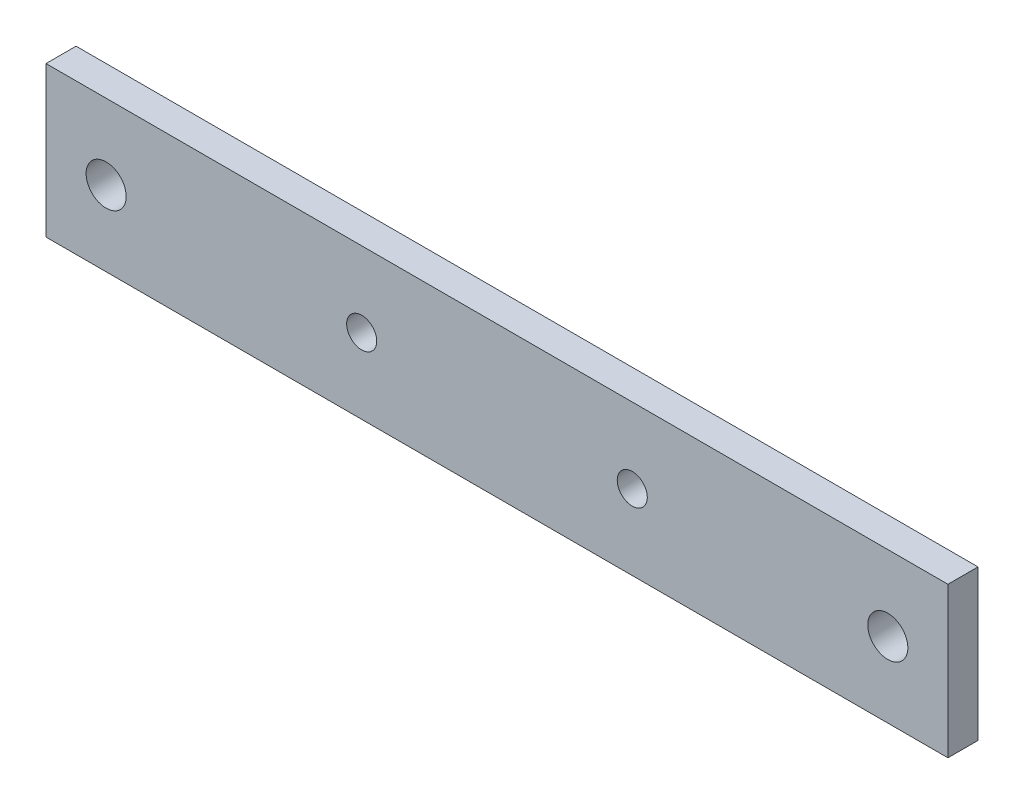
ISO-10303-21;
HEADER;
FILE_DESCRIPTION(('STEP AP214'),'2;1');
FILE_NAME('part.step','',(''),(''),'','','');
FILE_SCHEMA(('AUTOMOTIVE_DESIGN { 1 0 10303 214 1 1 1 1 }'));
ENDSEC;
DATA;
#1=APPLICATION_CONTEXT('core data for automotive mechanical design processes');
#2=APPLICATION_PROTOCOL_DEFINITION('international standard','automotive_design',2000,#1);
#3=PRODUCT_CONTEXT('',#1,'mechanical');
#4=PRODUCT('Part','Part','',(#3));
#5=PRODUCT_RELATED_PRODUCT_CATEGORY('part','',(#4));
#6=PRODUCT_DEFINITION_FORMATION('','',#4);
#7=PRODUCT_DEFINITION_CONTEXT('part definition',#1,'design');
#8=PRODUCT_DEFINITION('design','',#6,#7);
#9=PRODUCT_DEFINITION_SHAPE('','',#8);
#10=(LENGTH_UNIT() NAMED_UNIT(*) SI_UNIT(.MILLI.,.METRE.));
#11=(NAMED_UNIT(*) PLANE_ANGLE_UNIT() SI_UNIT($,.RADIAN.));
#12=(NAMED_UNIT(*) SI_UNIT($,.STERADIAN.) SOLID_ANGLE_UNIT());
#13=UNCERTAINTY_MEASURE_WITH_UNIT(LENGTH_MEASURE(1.E-05),#10,'distance_accuracy_value','');
#14=(GEOMETRIC_REPRESENTATION_CONTEXT(3) GLOBAL_UNCERTAINTY_ASSIGNED_CONTEXT((#13)) GLOBAL_UNIT_ASSIGNED_CONTEXT((#10,
#11,#12)) REPRESENTATION_CONTEXT('',''));
#15=CARTESIAN_POINT('',(0.,0.,0.));
#16=DIRECTION('',(0.,0.,1.));
#17=DIRECTION('',(1.,0.,0.));
#18=AXIS2_PLACEMENT_3D('',#15,#16,#17);
#19=CARTESIAN_POINT('',(0.,0.,3.));
#20=DIRECTION('',(0.,0.,1.));
#21=DIRECTION('',(1.,0.,0.));
#22=AXIS2_PLACEMENT_3D('',#19,#20,#21);
#23=PLANE('',#22);
#24=CARTESIAN_POINT('',(-39.,0.,3.));
#25=DIRECTION('',(0.,0.,1.));
#26=DIRECTION('',(1.,0.,0.));
#27=AXIS2_PLACEMENT_3D('',#24,#25,#26);
#28=CIRCLE('',#27,2.);
#29=CARTESIAN_POINT('',(-37.,0.,3.));
#30=VERTEX_POINT('',#29);
#31=EDGE_CURVE('E127',#30,#30,#28,.T.);
#32=ORIENTED_EDGE('',*,*,#31,.F.);
#33=EDGE_LOOP('',(#32));
#34=FACE_BOUND('',#33,.T.);
#35=CARTESIAN_POINT('',(-13.5,0.,3.));
#36=DIRECTION('',(0.,0.,1.));
#37=DIRECTION('',(1.,0.,0.));
#38=AXIS2_PLACEMENT_3D('',#35,#36,#37);
#39=CIRCLE('',#38,1.5);
#40=CARTESIAN_POINT('',(-12.,0.,3.));
#41=VERTEX_POINT('',#40);
#42=EDGE_CURVE('E106',#41,#41,#39,.T.);
#43=ORIENTED_EDGE('',*,*,#42,.F.);
#44=EDGE_LOOP('',(#43));
#45=FACE_BOUND('',#44,.T.);
#46=DIRECTION('',(0.,-1.,0.));
#47=VECTOR('',#46,1.);
#48=CARTESIAN_POINT('',(-45.,-7.50000000000001,3.));
#49=LINE('',#48,#47);
#50=CARTESIAN_POINT('',(-45.,7.49999999999999,3.));
#51=VERTEX_POINT('',#50);
#52=CARTESIAN_POINT('',(-45.,-7.50000000000001,3.));
#53=VERTEX_POINT('',#52);
#54=EDGE_CURVE('E91',#51,#53,#49,.T.);
#55=ORIENTED_EDGE('',*,*,#54,.T.);
#56=DIRECTION('',(1.,0.,0.));
#57=VECTOR('',#56,1.);
#58=CARTESIAN_POINT('',(45.,-7.49999999999999,3.));
#59=LINE('',#58,#57);
#60=CARTESIAN_POINT('',(45.,-7.49999999999999,3.));
#61=VERTEX_POINT('',#60);
#62=EDGE_CURVE('E86',#53,#61,#59,.T.);
#63=ORIENTED_EDGE('',*,*,#62,.T.);
#64=DIRECTION('',(0.,1.,0.));
#65=VECTOR('',#64,1.);
#66=CARTESIAN_POINT('',(45.,-7.49999999999999,3.));
#67=LINE('',#66,#65);
#68=CARTESIAN_POINT('',(45.,7.50000000000001,3.));
#69=VERTEX_POINT('',#68);
#70=EDGE_CURVE('E89',#61,#69,#67,.T.);
#71=ORIENTED_EDGE('',*,*,#70,.T.);
#72=DIRECTION('',(-1.,0.,0.));
#73=VECTOR('',#72,1.);
#74=CARTESIAN_POINT('',(45.,7.50000000000001,3.));
#75=LINE('',#74,#73);
#76=EDGE_CURVE('E56',#69,#51,#75,.T.);
#77=ORIENTED_EDGE('',*,*,#76,.T.);
#78=EDGE_LOOP('',(#55,#63,#71,#77));
#79=FACE_BOUND('',#78,.T.);
#80=CARTESIAN_POINT('',(13.5,0.,3.));
#81=DIRECTION('',(0.,0.,1.));
#82=DIRECTION('',(-1.,0.,0.));
#83=AXIS2_PLACEMENT_3D('',#80,#81,#82);
#84=CIRCLE('',#83,1.5);
#85=CARTESIAN_POINT('',(12.,0.,3.));
#86=VERTEX_POINT('',#85);
#87=EDGE_CURVE('E121',#86,#86,#84,.T.);
#88=ORIENTED_EDGE('',*,*,#87,.F.);
#89=EDGE_LOOP('',(#88));
#90=FACE_BOUND('',#89,.T.);
#91=CARTESIAN_POINT('',(39.,0.,3.));
#92=DIRECTION('',(0.,0.,1.));
#93=DIRECTION('',(-1.,0.,0.));
#94=AXIS2_PLACEMENT_3D('',#91,#92,#93);
#95=CIRCLE('',#94,2.);
#96=CARTESIAN_POINT('',(37.,0.,3.));
#97=VERTEX_POINT('',#96);
#98=EDGE_CURVE('E133',#97,#97,#95,.T.);
#99=ORIENTED_EDGE('',*,*,#98,.F.);
#100=EDGE_LOOP('',(#99));
#101=FACE_BOUND('',#100,.T.);
#102=ADVANCED_FACE('F39',(#34,#45,#79,#90,#101),#23,.T.);
#103=CARTESIAN_POINT('',(0.,0.,0.));
#104=DIRECTION('',(0.,0.,1.));
#105=DIRECTION('',(1.,0.,0.));
#106=AXIS2_PLACEMENT_3D('',#103,#104,#105);
#107=PLANE('',#106);
#108=DIRECTION('',(0.,-1.,0.));
#109=VECTOR('',#108,1.);
#110=CARTESIAN_POINT('',(-45.,-7.50000000000001,0.));
#111=LINE('',#110,#109);
#112=CARTESIAN_POINT('',(-45.,7.49999999999999,0.));
#113=VERTEX_POINT('',#112);
#114=CARTESIAN_POINT('',(-45.,-7.50000000000001,0.));
#115=VERTEX_POINT('',#114);
#116=EDGE_CURVE('E103',#113,#115,#111,.T.);
#117=ORIENTED_EDGE('',*,*,#116,.F.);
#118=DIRECTION('',(-1.,0.,0.));
#119=VECTOR('',#118,1.);
#120=CARTESIAN_POINT('',(45.,7.50000000000001,0.));
#121=LINE('',#120,#119);
#122=CARTESIAN_POINT('',(45.,7.50000000000001,0.));
#123=VERTEX_POINT('',#122);
#124=EDGE_CURVE('E79',#123,#113,#121,.T.);
#125=ORIENTED_EDGE('',*,*,#124,.F.);
#126=DIRECTION('',(0.,1.,0.));
#127=VECTOR('',#126,1.);
#128=CARTESIAN_POINT('',(45.,-7.49999999999999,0.));
#129=LINE('',#128,#127);
#130=CARTESIAN_POINT('',(45.,-7.49999999999999,0.));
#131=VERTEX_POINT('',#130);
#132=EDGE_CURVE('E73',#131,#123,#129,.T.);
#133=ORIENTED_EDGE('',*,*,#132,.F.);
#134=DIRECTION('',(1.,0.,0.));
#135=VECTOR('',#134,1.);
#136=CARTESIAN_POINT('',(45.,-7.49999999999999,0.));
#137=LINE('',#136,#135);
#138=EDGE_CURVE('E95',#115,#131,#137,.T.);
#139=ORIENTED_EDGE('',*,*,#138,.F.);
#140=EDGE_LOOP('',(#117,#125,#133,#139));
#141=FACE_BOUND('',#140,.T.);
#142=CARTESIAN_POINT('',(-13.5,0.,0.));
#143=DIRECTION('',(0.,0.,1.));
#144=DIRECTION('',(1.,0.,0.));
#145=AXIS2_PLACEMENT_3D('',#142,#143,#144);
#146=CIRCLE('',#145,1.5);
#147=CARTESIAN_POINT('',(-12.,0.,0.));
#148=VERTEX_POINT('',#147);
#149=EDGE_CURVE('E118',#148,#148,#146,.T.);
#150=ORIENTED_EDGE('',*,*,#149,.T.);
#151=EDGE_LOOP('',(#150));
#152=FACE_BOUND('',#151,.T.);
#153=CARTESIAN_POINT('',(13.5,0.,0.));
#154=DIRECTION('',(0.,0.,1.));
#155=DIRECTION('',(-1.,0.,0.));
#156=AXIS2_PLACEMENT_3D('',#153,#154,#155);
#157=CIRCLE('',#156,1.5);
#158=CARTESIAN_POINT('',(12.,0.,0.));
#159=VERTEX_POINT('',#158);
#160=EDGE_CURVE('E124',#159,#159,#157,.T.);
#161=ORIENTED_EDGE('',*,*,#160,.T.);
#162=EDGE_LOOP('',(#161));
#163=FACE_BOUND('',#162,.T.);
#164=CARTESIAN_POINT('',(-39.,0.,0.));
#165=DIRECTION('',(0.,0.,1.));
#166=DIRECTION('',(1.,0.,0.));
#167=AXIS2_PLACEMENT_3D('',#164,#165,#166);
#168=CIRCLE('',#167,2.);
#169=CARTESIAN_POINT('',(-37.,0.,0.));
#170=VERTEX_POINT('',#169);
#171=EDGE_CURVE('E130',#170,#170,#168,.T.);
#172=ORIENTED_EDGE('',*,*,#171,.T.);
#173=EDGE_LOOP('',(#172));
#174=FACE_BOUND('',#173,.T.);
#175=CARTESIAN_POINT('',(39.,0.,0.));
#176=DIRECTION('',(0.,0.,1.));
#177=DIRECTION('',(-1.,0.,0.));
#178=AXIS2_PLACEMENT_3D('',#175,#176,#177);
#179=CIRCLE('',#178,2.);
#180=CARTESIAN_POINT('',(37.,0.,0.));
#181=VERTEX_POINT('',#180);
#182=EDGE_CURVE('E136',#181,#181,#179,.T.);
#183=ORIENTED_EDGE('',*,*,#182,.T.);
#184=EDGE_LOOP('',(#183));
#185=FACE_BOUND('',#184,.T.);
#186=ADVANCED_FACE('F114',(#141,#152,#163,#174,#185),#107,.F.);
#187=CARTESIAN_POINT('',(-45.,-7.50000000000001,3.));
#188=DIRECTION('',(1.,0.,0.));
#189=DIRECTION('',(0.,0.,-1.));
#190=AXIS2_PLACEMENT_3D('',#187,#188,#189);
#191=PLANE('',#190);
#192=ORIENTED_EDGE('',*,*,#116,.T.);
#193=DIRECTION('',(0.,0.,-1.));
#194=VECTOR('',#193,1.);
#195=CARTESIAN_POINT('',(-45.,-7.50000000000001,3.));
#196=LINE('',#195,#194);
#197=EDGE_CURVE('E11',#53,#115,#196,.T.);
#198=ORIENTED_EDGE('',*,*,#197,.F.);
#199=ORIENTED_EDGE('',*,*,#54,.F.);
#200=DIRECTION('',(0.,0.,-1.));
#201=VECTOR('',#200,1.);
#202=CARTESIAN_POINT('',(-45.,7.49999999999999,3.));
#203=LINE('',#202,#201);
#204=EDGE_CURVE('E99',#51,#113,#203,.T.);
#205=ORIENTED_EDGE('',*,*,#204,.T.);
#206=EDGE_LOOP('',(#192,#198,#199,#205));
#207=FACE_BOUND('',#206,.T.);
#208=ADVANCED_FACE('F41',(#207),#191,.F.);
#209=CARTESIAN_POINT('',(45.,-7.49999999999999,3.));
#210=DIRECTION('',(0.,1.,0.));
#211=DIRECTION('',(-1.,0.,0.));
#212=AXIS2_PLACEMENT_3D('',#209,#210,#211);
#213=PLANE('',#212);
#214=ORIENTED_EDGE('',*,*,#138,.T.);
#215=DIRECTION('',(0.,0.,-1.));
#216=VECTOR('',#215,1.);
#217=CARTESIAN_POINT('',(45.,-7.49999999999999,3.));
#218=LINE('',#217,#216);
#219=EDGE_CURVE('E48',#61,#131,#218,.T.);
#220=ORIENTED_EDGE('',*,*,#219,.F.);
#221=ORIENTED_EDGE('',*,*,#62,.F.);
#222=ORIENTED_EDGE('',*,*,#197,.T.);
#223=EDGE_LOOP('',(#214,#220,#221,#222));
#224=FACE_BOUND('',#223,.T.);
#225=ADVANCED_FACE('F94',(#224),#213,.F.);
#226=CARTESIAN_POINT('',(45.,-7.49999999999999,3.));
#227=DIRECTION('',(-1.,0.,0.));
#228=DIRECTION('',(0.,0.,1.));
#229=AXIS2_PLACEMENT_3D('',#226,#227,#228);
#230=PLANE('',#229);
#231=ORIENTED_EDGE('',*,*,#132,.T.);
#232=DIRECTION('',(0.,0.,-1.));
#233=VECTOR('',#232,1.);
#234=CARTESIAN_POINT('',(45.,7.50000000000001,3.));
#235=LINE('',#234,#233);
#236=EDGE_CURVE('E96',#69,#123,#235,.T.);
#237=ORIENTED_EDGE('',*,*,#236,.F.);
#238=ORIENTED_EDGE('',*,*,#70,.F.);
#239=ORIENTED_EDGE('',*,*,#219,.T.);
#240=EDGE_LOOP('',(#231,#237,#238,#239));
#241=FACE_BOUND('',#240,.T.);
#242=ADVANCED_FACE('F97',(#241),#230,.F.);
#243=CARTESIAN_POINT('',(45.,7.50000000000001,3.));
#244=DIRECTION('',(0.,-1.,0.));
#245=DIRECTION('',(1.,0.,0.));
#246=AXIS2_PLACEMENT_3D('',#243,#244,#245);
#247=PLANE('',#246);
#248=ORIENTED_EDGE('',*,*,#124,.T.);
#249=ORIENTED_EDGE('',*,*,#204,.F.);
#250=ORIENTED_EDGE('',*,*,#76,.F.);
#251=ORIENTED_EDGE('',*,*,#236,.T.);
#252=EDGE_LOOP('',(#248,#249,#250,#251));
#253=FACE_BOUND('',#252,.T.);
#254=ADVANCED_FACE('F111',(#253),#247,.F.);
#255=CARTESIAN_POINT('',(-13.5,0.,3.));
#256=DIRECTION('',(0.,0.,-1.));
#257=DIRECTION('',(-1.,0.,0.));
#258=AXIS2_PLACEMENT_3D('',#255,#256,#257);
#259=CYLINDRICAL_SURFACE('',#258,1.5);
#260=ORIENTED_EDGE('',*,*,#42,.T.);
#261=EDGE_LOOP('',(#260));
#262=FACE_BOUND('',#261,.T.);
#263=ORIENTED_EDGE('',*,*,#149,.F.);
#264=EDGE_LOOP('',(#263));
#265=FACE_BOUND('',#264,.T.);
#266=ADVANCED_FACE('F155',(#262,#265),#259,.F.);
#267=CARTESIAN_POINT('',(13.5,0.,3.));
#268=DIRECTION('',(0.,0.,-1.));
#269=DIRECTION('',(-1.,0.,0.));
#270=AXIS2_PLACEMENT_3D('',#267,#268,#269);
#271=CYLINDRICAL_SURFACE('',#270,1.5);
#272=ORIENTED_EDGE('',*,*,#87,.T.);
#273=EDGE_LOOP('',(#272));
#274=FACE_BOUND('',#273,.T.);
#275=ORIENTED_EDGE('',*,*,#160,.F.);
#276=EDGE_LOOP('',(#275));
#277=FACE_BOUND('',#276,.T.);
#278=ADVANCED_FACE('F200',(#274,#277),#271,.F.);
#279=CARTESIAN_POINT('',(-39.,0.,3.));
#280=DIRECTION('',(0.,0.,-1.));
#281=DIRECTION('',(-1.,0.,0.));
#282=AXIS2_PLACEMENT_3D('',#279,#280,#281);
#283=CYLINDRICAL_SURFACE('',#282,2.);
#284=ORIENTED_EDGE('',*,*,#31,.T.);
#285=EDGE_LOOP('',(#284));
#286=FACE_BOUND('',#285,.T.);
#287=ORIENTED_EDGE('',*,*,#171,.F.);
#288=EDGE_LOOP('',(#287));
#289=FACE_BOUND('',#288,.T.);
#290=ADVANCED_FACE('F208',(#286,#289),#283,.F.);
#291=CARTESIAN_POINT('',(39.,0.,3.));
#292=DIRECTION('',(0.,0.,-1.));
#293=DIRECTION('',(-1.,0.,0.));
#294=AXIS2_PLACEMENT_3D('',#291,#292,#293);
#295=CYLINDRICAL_SURFACE('',#294,2.);
#296=ORIENTED_EDGE('',*,*,#98,.T.);
#297=EDGE_LOOP('',(#296));
#298=FACE_BOUND('',#297,.T.);
#299=ORIENTED_EDGE('',*,*,#182,.F.);
#300=EDGE_LOOP('',(#299));
#301=FACE_BOUND('',#300,.T.);
#302=ADVANCED_FACE('F142',(#298,#301),#295,.F.);
#303=CLOSED_SHELL('',(#102,#186,#208,#225,#242,#254,#266,#278,#290,#302));
#304=MANIFOLD_SOLID_BREP('B2',#303);
#305=ADVANCED_BREP_SHAPE_REPRESENTATION('',(#18,#304),#14);
#306=SHAPE_DEFINITION_REPRESENTATION(#9,#305);
ENDSEC;
END-ISO-10303-21;
